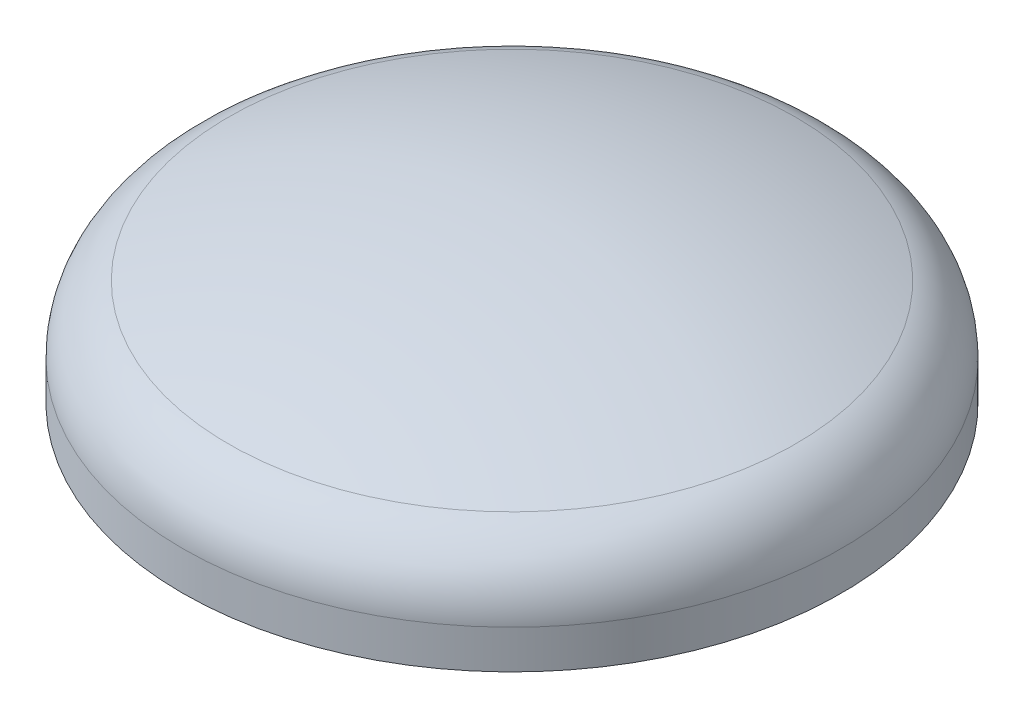
ISO-10303-21;
HEADER;
FILE_DESCRIPTION(('STEP AP214'),'2;1');
FILE_NAME('part.step','',(''),(''),'','','');
FILE_SCHEMA(('AUTOMOTIVE_DESIGN { 1 0 10303 214 1 1 1 1 }'));
ENDSEC;
DATA;
#1=APPLICATION_CONTEXT('core data for automotive mechanical design processes');
#2=APPLICATION_PROTOCOL_DEFINITION('international standard','automotive_design',2000,#1);
#3=PRODUCT_CONTEXT('',#1,'mechanical');
#4=PRODUCT('Part','Part','',(#3));
#5=PRODUCT_RELATED_PRODUCT_CATEGORY('part','',(#4));
#6=PRODUCT_DEFINITION_FORMATION('','',#4);
#7=PRODUCT_DEFINITION_CONTEXT('part definition',#1,'design');
#8=PRODUCT_DEFINITION('design','',#6,#7);
#9=PRODUCT_DEFINITION_SHAPE('','',#8);
#10=(LENGTH_UNIT() NAMED_UNIT(*) SI_UNIT(.MILLI.,.METRE.));
#11=(NAMED_UNIT(*) PLANE_ANGLE_UNIT() SI_UNIT($,.RADIAN.));
#12=(NAMED_UNIT(*) SI_UNIT($,.STERADIAN.) SOLID_ANGLE_UNIT());
#13=UNCERTAINTY_MEASURE_WITH_UNIT(LENGTH_MEASURE(1.E-05),#10,'distance_accuracy_value','');
#14=(GEOMETRIC_REPRESENTATION_CONTEXT(3) GLOBAL_UNCERTAINTY_ASSIGNED_CONTEXT((#13)) GLOBAL_UNIT_ASSIGNED_CONTEXT((#10,
#11,#12)) REPRESENTATION_CONTEXT('',''));
#15=CARTESIAN_POINT('',(0.,0.,0.));
#16=DIRECTION('',(0.,0.,1.));
#17=DIRECTION('',(1.,0.,0.));
#18=AXIS2_PLACEMENT_3D('',#15,#16,#17);
#19=CARTESIAN_POINT('',(0.,0.,0.));
#20=DIRECTION('',(0.,1.,0.));
#21=DIRECTION('',(0.,0.,1.));
#22=AXIS2_PLACEMENT_3D('',#19,#20,#21);
#23=PLANE('',#22);
#24=CARTESIAN_POINT('',(0.,0.,0.));
#25=DIRECTION('',(0.,1.,0.));
#26=DIRECTION('',(0.,0.,1.));
#27=AXIS2_PLACEMENT_3D('',#24,#25,#26);
#28=CIRCLE('',#27,219.075);
#29=CARTESIAN_POINT('',(0.,0.,219.075));
#30=VERTEX_POINT('',#29);
#31=EDGE_CURVE('E80',#30,#30,#28,.F.);
#32=ORIENTED_EDGE('',*,*,#31,.F.);
#33=EDGE_LOOP('',(#32));
#34=FACE_BOUND('',#33,.T.);
#35=CARTESIAN_POINT('',(0.,0.,0.));
#36=DIRECTION('',(0.,-1.,0.));
#37=DIRECTION('',(0.,0.,-1.));
#38=AXIS2_PLACEMENT_3D('',#35,#36,#37);
#39=CIRCLE('',#38,228.6);
#40=CARTESIAN_POINT('',(0.,0.,-228.6));
#41=VERTEX_POINT('',#40);
#42=EDGE_CURVE('E11',#41,#41,#39,.T.);
#43=ORIENTED_EDGE('',*,*,#42,.T.);
#44=EDGE_LOOP('',(#43));
#45=FACE_BOUND('',#44,.T.);
#46=ADVANCED_FACE('F41',(#34,#45),#23,.F.);
#47=CARTESIAN_POINT('',(0.,0.,0.));
#48=DIRECTION('',(0.,-1.,0.));
#49=DIRECTION('',(0.,0.,-1.));
#50=AXIS2_PLACEMENT_3D('',#47,#48,#49);
#51=CYLINDRICAL_SURFACE('',#50,228.6);
#52=ORIENTED_EDGE('',*,*,#42,.F.);
#53=EDGE_LOOP('',(#52));
#54=FACE_BOUND('',#53,.T.);
#55=CARTESIAN_POINT('',(0.,26.8420765089723,0.));
#56=DIRECTION('',(0.,-1.,0.));
#57=DIRECTION('',(0.,0.,-1.));
#58=AXIS2_PLACEMENT_3D('',#55,#56,#57);
#59=CIRCLE('',#58,228.6);
#60=CARTESIAN_POINT('',(0.,26.8420765089723,-228.6));
#61=VERTEX_POINT('',#60);
#62=EDGE_CURVE('E48',#61,#61,#59,.T.);
#63=ORIENTED_EDGE('',*,*,#62,.T.);
#64=EDGE_LOOP('',(#63));
#65=FACE_BOUND('',#64,.T.);
#66=ADVANCED_FACE('F68',(#54,#65),#51,.T.);
#67=CARTESIAN_POINT('',(0.,26.8420765089723,0.));
#68=DIRECTION('',(0.,-1.,0.));
#69=DIRECTION('',(0.,0.,-1.));
#70=AXIS2_PLACEMENT_3D('',#67,#68,#69);
#71=TOROIDAL_SURFACE('',#70,178.6,50.);
#72=ORIENTED_EDGE('',*,*,#62,.F.);
#73=EDGE_LOOP('',(#72));
#74=FACE_BOUND('',#73,.T.);
#75=CARTESIAN_POINT('',(0.,73.5101576727013,0.));
#76=DIRECTION('',(0.,-1.,0.));
#77=DIRECTION('',(0.,0.,-1.));
#78=AXIS2_PLACEMENT_3D('',#75,#76,#77);
#79=CIRCLE('',#78,196.546871607486);
#80=CARTESIAN_POINT('',(0.,73.5101576727013,-196.546871607486));
#81=VERTEX_POINT('',#80);
#82=EDGE_CURVE('E86',#81,#81,#79,.T.);
#83=ORIENTED_EDGE('',*,*,#82,.T.);
#84=EDGE_LOOP('',(#83));
#85=FACE_BOUND('',#84,.T.);
#86=ADVANCED_FACE('F75',(#74,#85),#71,.T.);
#87=CARTESIAN_POINT('',(0.,-437.579999999993,8.74890624807945E-05));
#88=DIRECTION('',(-1.,0.,0.));
#89=DIRECTION('',(0.,0.,-1.));
#90=AXIS2_PLACEMENT_3D('',#87,#88,#89);
#91=CIRCLE('',#90,547.58);
#92=TRIMMED_CURVE('',#91,(PARAMETER_VALUE(-1.57079616702087)),
(PARAMETER_VALUE(1.57079616702087)),.T.,.PARAMETER.);
#93=CARTESIAN_POINT('',(0.,-437.579999999993,0.));
#94=DIRECTION('',(0.,-1.,0.));
#95=AXIS1_PLACEMENT('',#93,#94);
#96=SURFACE_OF_REVOLUTION('',#92,#95);
#97=ORIENTED_EDGE('',*,*,#82,.F.);
#98=EDGE_LOOP('',(#97));
#99=FACE_BOUND('',#98,.T.);
#100=CARTESIAN_POINT('',(0.,110.,0.));
#101=VERTEX_POINT('',#100);
#102=VERTEX_LOOP('',#101);
#103=FACE_BOUND('',#102,.T.);
#104=ADVANCED_FACE('F98',(#99,#103),#96,.T.);
#105=CARTESIAN_POINT('',(0.,0.,0.));
#106=DIRECTION('',(0.,-1.,0.));
#107=DIRECTION('',(0.,0.,-1.));
#108=AXIS2_PLACEMENT_3D('',#105,#106,#107);
#109=CYLINDRICAL_SURFACE('',#108,219.075);
#110=ORIENTED_EDGE('',*,*,#31,.T.);
#111=EDGE_LOOP('',(#110));
#112=FACE_BOUND('',#111,.T.);
#113=CARTESIAN_POINT('',(0.,26.8420765089723,0.));
#114=DIRECTION('',(0.,-1.,0.));
#115=DIRECTION('',(0.,0.,-1.));
#116=AXIS2_PLACEMENT_3D('',#113,#114,#115);
#117=CIRCLE('',#116,219.075);
#118=CARTESIAN_POINT('',(0.,26.8420765089723,-219.075));
#119=VERTEX_POINT('',#118);
#120=EDGE_CURVE('E91',#119,#119,#117,.T.);
#121=ORIENTED_EDGE('',*,*,#120,.F.);
#122=EDGE_LOOP('',(#121));
#123=FACE_BOUND('',#122,.T.);
#124=ADVANCED_FACE('F62',(#112,#123),#109,.F.);
#125=CARTESIAN_POINT('',(0.,26.8420765089723,0.));
#126=DIRECTION('',(0.,-1.,0.));
#127=DIRECTION('',(0.,0.,-1.));
#128=AXIS2_PLACEMENT_3D('',#125,#126,#127);
#129=TOROIDAL_SURFACE('',#128,178.6,40.475);
#130=ORIENTED_EDGE('',*,*,#120,.T.);
#131=EDGE_LOOP('',(#130));
#132=FACE_BOUND('',#131,.T.);
#133=CARTESIAN_POINT('',(0.,64.6198882110109,0.));
#134=DIRECTION('',(0.,-1.,0.));
#135=DIRECTION('',(0.,0.,-1.));
#136=AXIS2_PLACEMENT_3D('',#133,#134,#135);
#137=CIRCLE('',#136,193.12799256626);
#138=CARTESIAN_POINT('',(0.,64.6198882110109,-193.12799256626));
#139=VERTEX_POINT('',#138);
#140=EDGE_CURVE('E92',#139,#139,#137,.T.);
#141=ORIENTED_EDGE('',*,*,#140,.F.);
#142=EDGE_LOOP('',(#141));
#143=FACE_BOUND('',#142,.T.);
#144=ADVANCED_FACE('F56',(#132,#143),#129,.F.);
#145=CARTESIAN_POINT('',(0.,-437.579999999993,8.74890624807945E-05));
#146=DIRECTION('',(-1.,0.,0.));
#147=DIRECTION('',(0.,0.,-1.));
#148=AXIS2_PLACEMENT_3D('',#145,#146,#147);
#149=CIRCLE('',#148,538.055);
#150=TRIMMED_CURVE('',#149,(PARAMETER_VALUE(-1.57079616419244)),
(PARAMETER_VALUE(1.57079616419244)),.T.,.PARAMETER.);
#151=CARTESIAN_POINT('',(0.,-437.579999999993,0.));
#152=DIRECTION('',(0.,-1.,0.));
#153=AXIS1_PLACEMENT('',#151,#152);
#154=SURFACE_OF_REVOLUTION('',#150,#153);
#155=ORIENTED_EDGE('',*,*,#140,.T.);
#156=EDGE_LOOP('',(#155));
#157=FACE_BOUND('',#156,.T.);
#158=CARTESIAN_POINT('',(0.,100.475,0.));
#159=VERTEX_POINT('',#158);
#160=VERTEX_LOOP('',#159);
#161=FACE_BOUND('',#160,.T.);
#162=ADVANCED_FACE('F54',(#157,#161),#154,.F.);
#163=CLOSED_SHELL('',(#46,#66,#86,#104,#124,#144,#162));
#164=MANIFOLD_SOLID_BREP('B2',#163);
#165=ADVANCED_BREP_SHAPE_REPRESENTATION('',(#18,#164),#14);
#166=SHAPE_DEFINITION_REPRESENTATION(#9,#165);
ENDSEC;
END-ISO-10303-21;
